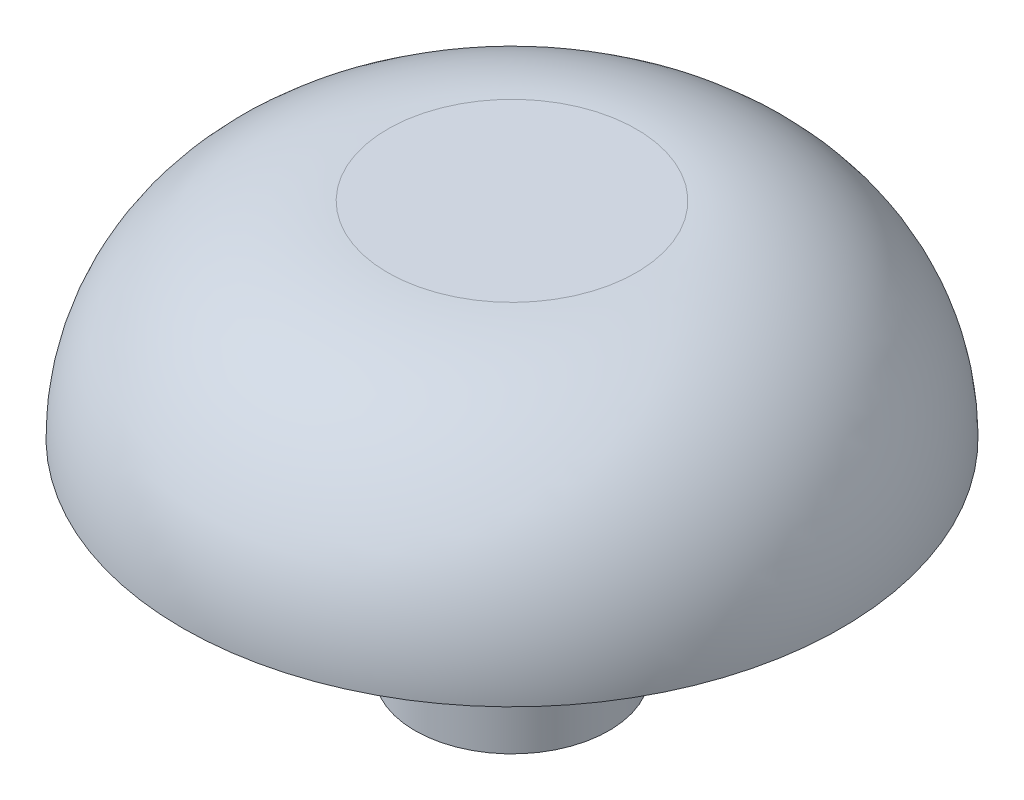
ISO-10303-21;
HEADER;
FILE_DESCRIPTION(('STEP AP214'),'2;1');
FILE_NAME('part.step','',(''),(''),'','','');
FILE_SCHEMA(('AUTOMOTIVE_DESIGN { 1 0 10303 214 1 1 1 1 }'));
ENDSEC;
DATA;
#1=APPLICATION_CONTEXT('core data for automotive mechanical design processes');
#2=APPLICATION_PROTOCOL_DEFINITION('international standard','automotive_design',2000,#1);
#3=PRODUCT_CONTEXT('',#1,'mechanical');
#4=PRODUCT('Part','Part','',(#3));
#5=PRODUCT_RELATED_PRODUCT_CATEGORY('part','',(#4));
#6=PRODUCT_DEFINITION_FORMATION('','',#4);
#7=PRODUCT_DEFINITION_CONTEXT('part definition',#1,'design');
#8=PRODUCT_DEFINITION('design','',#6,#7);
#9=PRODUCT_DEFINITION_SHAPE('','',#8);
#10=(LENGTH_UNIT() NAMED_UNIT(*) SI_UNIT(.MILLI.,.METRE.));
#11=(NAMED_UNIT(*) PLANE_ANGLE_UNIT() SI_UNIT($,.RADIAN.));
#12=(NAMED_UNIT(*) SI_UNIT($,.STERADIAN.) SOLID_ANGLE_UNIT());
#13=UNCERTAINTY_MEASURE_WITH_UNIT(LENGTH_MEASURE(1.E-05),#10,'distance_accuracy_value','');
#14=(GEOMETRIC_REPRESENTATION_CONTEXT(3) GLOBAL_UNCERTAINTY_ASSIGNED_CONTEXT((#13)) GLOBAL_UNIT_ASSIGNED_CONTEXT((#10,
#11,#12)) REPRESENTATION_CONTEXT('',''));
#15=CARTESIAN_POINT('',(0.,0.,0.));
#16=DIRECTION('',(0.,0.,1.));
#17=DIRECTION('',(1.,0.,0.));
#18=AXIS2_PLACEMENT_3D('',#15,#16,#17);
#19=CARTESIAN_POINT('',(0.,0.,0.));
#20=DIRECTION('',(0.,-1.,0.));
#21=DIRECTION('',(0.,0.,-1.));
#22=AXIS2_PLACEMENT_3D('',#19,#20,#21);
#23=PLANE('',#22);
#24=CARTESIAN_POINT('',(0.,0.,0.));
#25=DIRECTION('',(0.,1.,0.));
#26=DIRECTION('',(0.,0.,1.));
#27=AXIS2_PLACEMENT_3D('',#24,#25,#26);
#28=CIRCLE('',#27,5.);
#29=CARTESIAN_POINT('',(0.,0.,5.));
#30=VERTEX_POINT('',#29);
#31=EDGE_CURVE('E11',#30,#30,#28,.T.);
#32=ORIENTED_EDGE('',*,*,#31,.T.);
#33=EDGE_LOOP('',(#32));
#34=FACE_BOUND('',#33,.T.);
#35=ADVANCED_FACE('F36',(#34),#23,.F.);
#36=CARTESIAN_POINT('',(0.,-8.25,0.));
#37=DIRECTION('',(0.,1.,0.));
#38=DIRECTION('',(0.,0.,1.));
#39=AXIS2_PLACEMENT_3D('',#36,#37,#38);
#40=DEGENERATE_TOROIDAL_SURFACE('',#39,5.,8.25,.T.);
#41=ORIENTED_EDGE('',*,*,#31,.F.);
#42=EDGE_LOOP('',(#41));
#43=FACE_BOUND('',#42,.T.);
#44=CARTESIAN_POINT('',(0.,-8.25,0.));
#45=DIRECTION('',(0.,1.,0.));
#46=DIRECTION('',(0.,0.,1.));
#47=AXIS2_PLACEMENT_3D('',#44,#45,#46);
#48=CIRCLE('',#47,13.25);
#49=CARTESIAN_POINT('',(0.,-8.25,13.25));
#50=VERTEX_POINT('',#49);
#51=EDGE_CURVE('E42',#50,#50,#48,.T.);
#52=ORIENTED_EDGE('',*,*,#51,.T.);
#53=EDGE_LOOP('',(#52));
#54=FACE_BOUND('',#53,.T.);
#55=ADVANCED_FACE('F76',(#43,#54),#40,.T.);
#56=CARTESIAN_POINT('',(11.25,-8.25,0.));
#57=DIRECTION('',(0.,1.,0.));
#58=DIRECTION('',(0.,0.,1.));
#59=AXIS2_PLACEMENT_3D('',#56,#57,#58);
#60=PLANE('',#59);
#61=ORIENTED_EDGE('',*,*,#51,.F.);
#62=EDGE_LOOP('',(#61));
#63=FACE_BOUND('',#62,.T.);
#64=CARTESIAN_POINT('',(0.,-8.25,0.));
#65=DIRECTION('',(0.,1.,0.));
#66=DIRECTION('',(0.,0.,1.));
#67=AXIS2_PLACEMENT_3D('',#64,#65,#66);
#68=CIRCLE('',#67,11.25);
#69=CARTESIAN_POINT('',(0.,-8.25,11.25));
#70=VERTEX_POINT('',#69);
#71=EDGE_CURVE('E71',#70,#70,#68,.T.);
#72=ORIENTED_EDGE('',*,*,#71,.T.);
#73=EDGE_LOOP('',(#72));
#74=FACE_BOUND('',#73,.T.);
#75=ADVANCED_FACE('F78',(#63,#74),#60,.F.);
#76=CARTESIAN_POINT('',(0.,-8.25,0.));
#77=DIRECTION('',(0.,1.,0.));
#78=DIRECTION('',(0.,0.,1.));
#79=AXIS2_PLACEMENT_3D('',#76,#77,#78);
#80=DEGENERATE_TOROIDAL_SURFACE('',#79,5.,6.25,.T.);
#81=ORIENTED_EDGE('',*,*,#71,.F.);
#82=EDGE_LOOP('',(#81));
#83=FACE_BOUND('',#82,.T.);
#84=CARTESIAN_POINT('',(0.,-2.,0.));
#85=DIRECTION('',(0.,1.,0.));
#86=DIRECTION('',(0.,0.,1.));
#87=AXIS2_PLACEMENT_3D('',#84,#85,#86);
#88=CIRCLE('',#87,5.);
#89=CARTESIAN_POINT('',(0.,-2.,5.));
#90=VERTEX_POINT('',#89);
#91=EDGE_CURVE('E68',#90,#90,#88,.T.);
#92=ORIENTED_EDGE('',*,*,#91,.T.);
#93=EDGE_LOOP('',(#92));
#94=FACE_BOUND('',#93,.T.);
#95=ADVANCED_FACE('F81',(#83,#94),#80,.F.);
#96=CARTESIAN_POINT('',(3.9,-2.,0.));
#97=DIRECTION('',(0.,1.,0.));
#98=DIRECTION('',(0.,0.,1.));
#99=AXIS2_PLACEMENT_3D('',#96,#97,#98);
#100=PLANE('',#99);
#101=ORIENTED_EDGE('',*,*,#91,.F.);
#102=EDGE_LOOP('',(#101));
#103=FACE_BOUND('',#102,.T.);
#104=CARTESIAN_POINT('',(0.,-2.,0.));
#105=DIRECTION('',(0.,1.,0.));
#106=DIRECTION('',(0.,0.,1.));
#107=AXIS2_PLACEMENT_3D('',#104,#105,#106);
#108=CIRCLE('',#107,3.9);
#109=CARTESIAN_POINT('',(0.,-2.,3.9));
#110=VERTEX_POINT('',#109);
#111=EDGE_CURVE('E59',#110,#110,#108,.T.);
#112=ORIENTED_EDGE('',*,*,#111,.T.);
#113=EDGE_LOOP('',(#112));
#114=FACE_BOUND('',#113,.T.);
#115=ADVANCED_FACE('F87',(#103,#114),#100,.F.);
#116=CARTESIAN_POINT('',(0.,0.,0.));
#117=DIRECTION('',(0.,1.,0.));
#118=DIRECTION('',(0.,0.,1.));
#119=AXIS2_PLACEMENT_3D('',#116,#117,#118);
#120=CYLINDRICAL_SURFACE('',#119,3.9);
#121=ORIENTED_EDGE('',*,*,#111,.F.);
#122=EDGE_LOOP('',(#121));
#123=FACE_BOUND('',#122,.T.);
#124=CARTESIAN_POINT('',(0.,-16.5,0.));
#125=DIRECTION('',(0.,1.,0.));
#126=DIRECTION('',(0.,0.,1.));
#127=AXIS2_PLACEMENT_3D('',#124,#125,#126);
#128=CIRCLE('',#127,3.9);
#129=CARTESIAN_POINT('',(0.,-16.5,3.9));
#130=VERTEX_POINT('',#129);
#131=EDGE_CURVE('E55',#130,#130,#128,.T.);
#132=ORIENTED_EDGE('',*,*,#131,.T.);
#133=EDGE_LOOP('',(#132));
#134=FACE_BOUND('',#133,.T.);
#135=ADVANCED_FACE('F93',(#123,#134),#120,.T.);
#136=CARTESIAN_POINT('',(0.,-16.5,0.));
#137=DIRECTION('',(0.,1.,0.));
#138=DIRECTION('',(0.,0.,1.));
#139=AXIS2_PLACEMENT_3D('',#136,#137,#138);
#140=PLANE('',#139);
#141=CARTESIAN_POINT('',(0.,-16.5,0.));
#142=DIRECTION('',(0.,-1.,0.));
#143=DIRECTION('',(0.,0.,-1.));
#144=AXIS2_PLACEMENT_3D('',#141,#142,#143);
#145=CIRCLE('',#144,2.025);
#146=CARTESIAN_POINT('',(0.,-16.5,-2.025));
#147=VERTEX_POINT('',#146);
#148=EDGE_CURVE('E62',#147,#147,#145,.T.);
#149=ORIENTED_EDGE('',*,*,#148,.F.);
#150=EDGE_LOOP('',(#149));
#151=FACE_BOUND('',#150,.T.);
#152=ORIENTED_EDGE('',*,*,#131,.F.);
#153=EDGE_LOOP('',(#152));
#154=FACE_BOUND('',#153,.T.);
#155=ADVANCED_FACE('F49',(#151,#154),#140,.F.);
#156=CARTESIAN_POINT('',(0.,-5.,0.));
#157=DIRECTION('',(0.,-1.,0.));
#158=DIRECTION('',(0.,0.,-1.));
#159=AXIS2_PLACEMENT_3D('',#156,#157,#158);
#160=CONICAL_SURFACE('',#159,1.64999999999999,1.02974425867665);
#161=CARTESIAN_POINT('',(0.,-4.00857997860453,0.));
#162=VERTEX_POINT('',#161);
#163=VERTEX_LOOP('',#162);
#164=FACE_BOUND('',#163,.T.);
#165=CARTESIAN_POINT('',(0.,-5.,0.));
#166=DIRECTION('',(0.,-1.,0.));
#167=DIRECTION('',(0.,0.,-1.));
#168=AXIS2_PLACEMENT_3D('',#165,#166,#167);
#169=CIRCLE('',#168,1.64999999999999);
#170=CARTESIAN_POINT('',(0.,-5.,-1.64999999999999));
#171=VERTEX_POINT('',#170);
#172=EDGE_CURVE('E53',#171,#171,#169,.T.);
#173=ORIENTED_EDGE('',*,*,#172,.T.);
#174=EDGE_LOOP('',(#173));
#175=FACE_BOUND('',#174,.T.);
#176=ADVANCED_FACE('F45',(#164,#175),#160,.F.);
#177=CARTESIAN_POINT('',(0.,-16.5,0.));
#178=DIRECTION('',(0.,-1.,0.));
#179=DIRECTION('',(0.,0.,-1.));
#180=AXIS2_PLACEMENT_3D('',#177,#178,#179);
#181=CYLINDRICAL_SURFACE('',#180,1.64999999999999);
#182=ORIENTED_EDGE('',*,*,#172,.F.);
#183=EDGE_LOOP('',(#182));
#184=FACE_BOUND('',#183,.T.);
#185=CARTESIAN_POINT('',(0.,-16.125,0.));
#186=DIRECTION('',(0.,-1.,0.));
#187=DIRECTION('',(0.,0.,-1.));
#188=AXIS2_PLACEMENT_3D('',#185,#186,#187);
#189=CIRCLE('',#188,1.65);
#190=CARTESIAN_POINT('',(0.,-16.125,-1.65));
#191=VERTEX_POINT('',#190);
#192=EDGE_CURVE('E56',#191,#191,#189,.T.);
#193=ORIENTED_EDGE('',*,*,#192,.T.);
#194=EDGE_LOOP('',(#193));
#195=FACE_BOUND('',#194,.T.);
#196=ADVANCED_FACE('F48',(#184,#195),#181,.F.);
#197=CARTESIAN_POINT('',(0.,-16.5,0.));
#198=DIRECTION('',(0.,-1.,0.));
#199=DIRECTION('',(0.,0.,-1.));
#200=AXIS2_PLACEMENT_3D('',#197,#198,#199);
#201=CONICAL_SURFACE('',#200,2.025,0.785398163397444);
#202=ORIENTED_EDGE('',*,*,#192,.F.);
#203=EDGE_LOOP('',(#202));
#204=FACE_BOUND('',#203,.T.);
#205=ORIENTED_EDGE('',*,*,#148,.T.);
#206=EDGE_LOOP('',(#205));
#207=FACE_BOUND('',#206,.T.);
#208=ADVANCED_FACE('F153',(#204,#207),#201,.F.);
#209=CLOSED_SHELL('',(#35,#55,#75,#95,#115,#135,#155,#176,#196,#208));
#210=MANIFOLD_SOLID_BREP('B2',#209);
#211=ADVANCED_BREP_SHAPE_REPRESENTATION('',(#18,#210),#14);
#212=SHAPE_DEFINITION_REPRESENTATION(#9,#211);
ENDSEC;
END-ISO-10303-21;
